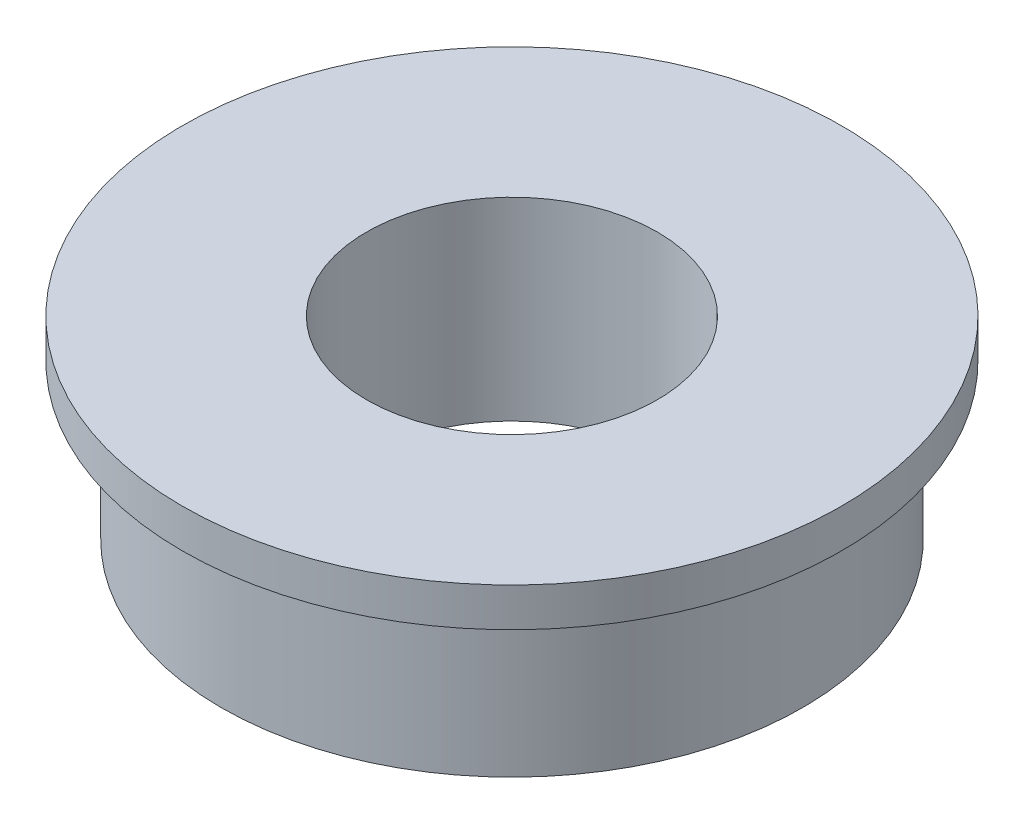
ISO-10303-21;
HEADER;
FILE_DESCRIPTION(('STEP AP214'),'2;1');
FILE_NAME('part.step','',(''),(''),'','','');
FILE_SCHEMA(('AUTOMOTIVE_DESIGN { 1 0 10303 214 1 1 1 1 }'));
ENDSEC;
DATA;
#1=APPLICATION_CONTEXT('core data for automotive mechanical design processes');
#2=APPLICATION_PROTOCOL_DEFINITION('international standard','automotive_design',2000,#1);
#3=PRODUCT_CONTEXT('',#1,'mechanical');
#4=PRODUCT('Part','Part','',(#3));
#5=PRODUCT_RELATED_PRODUCT_CATEGORY('part','',(#4));
#6=PRODUCT_DEFINITION_FORMATION('','',#4);
#7=PRODUCT_DEFINITION_CONTEXT('part definition',#1,'design');
#8=PRODUCT_DEFINITION('design','',#6,#7);
#9=PRODUCT_DEFINITION_SHAPE('','',#8);
#10=(LENGTH_UNIT() NAMED_UNIT(*) SI_UNIT(.MILLI.,.METRE.));
#11=(NAMED_UNIT(*) PLANE_ANGLE_UNIT() SI_UNIT($,.RADIAN.));
#12=(NAMED_UNIT(*) SI_UNIT($,.STERADIAN.) SOLID_ANGLE_UNIT());
#13=UNCERTAINTY_MEASURE_WITH_UNIT(LENGTH_MEASURE(1.E-05),#10,'distance_accuracy_value','');
#14=(GEOMETRIC_REPRESENTATION_CONTEXT(3) GLOBAL_UNCERTAINTY_ASSIGNED_CONTEXT((#13)) GLOBAL_UNIT_ASSIGNED_CONTEXT((#10,
#11,#12)) REPRESENTATION_CONTEXT('',''));
#15=CARTESIAN_POINT('',(0.,0.,0.));
#16=DIRECTION('',(0.,0.,1.));
#17=DIRECTION('',(1.,0.,0.));
#18=AXIS2_PLACEMENT_3D('',#15,#16,#17);
#19=CARTESIAN_POINT('',(0.,0.,0.));
#20=DIRECTION('',(0.,1.,0.));
#21=DIRECTION('',(0.,0.,1.));
#22=AXIS2_PLACEMENT_3D('',#19,#20,#21);
#23=PLANE('',#22);
#24=CARTESIAN_POINT('',(0.,0.,0.));
#25=DIRECTION('',(0.,1.,0.));
#26=DIRECTION('',(0.,0.,1.));
#27=AXIS2_PLACEMENT_3D('',#24,#25,#26);
#28=CIRCLE('',#27,6.);
#29=CARTESIAN_POINT('',(0.,0.,6.));
#30=VERTEX_POINT('',#29);
#31=EDGE_CURVE('E41',#30,#30,#28,.T.);
#32=ORIENTED_EDGE('',*,*,#31,.F.);
#33=EDGE_LOOP('',(#32));
#34=FACE_BOUND('',#33,.T.);
#35=CARTESIAN_POINT('',(0.,0.,0.));
#36=DIRECTION('',(0.,1.,0.));
#37=DIRECTION('',(0.,0.,1.));
#38=AXIS2_PLACEMENT_3D('',#35,#36,#37);
#39=CIRCLE('',#38,3.);
#40=CARTESIAN_POINT('',(0.,0.,3.));
#41=VERTEX_POINT('',#40);
#42=EDGE_CURVE('E50',#41,#41,#39,.T.);
#43=ORIENTED_EDGE('',*,*,#42,.T.);
#44=EDGE_LOOP('',(#43));
#45=FACE_BOUND('',#44,.T.);
#46=ADVANCED_FACE('F37',(#34,#45),#23,.F.);
#47=CARTESIAN_POINT('',(0.,3.2,0.));
#48=DIRECTION('',(0.,-1.,0.));
#49=DIRECTION('',(0.,0.,-1.));
#50=AXIS2_PLACEMENT_3D('',#47,#48,#49);
#51=CYLINDRICAL_SURFACE('',#50,6.);
#52=CARTESIAN_POINT('',(0.,3.2,0.));
#53=DIRECTION('',(0.,1.,0.));
#54=DIRECTION('',(0.,0.,1.));
#55=AXIS2_PLACEMENT_3D('',#52,#53,#54);
#56=CIRCLE('',#55,6.);
#57=CARTESIAN_POINT('',(0.,3.2,6.));
#58=VERTEX_POINT('',#57);
#59=EDGE_CURVE('E10',#58,#58,#56,.T.);
#60=ORIENTED_EDGE('',*,*,#59,.F.);
#61=EDGE_LOOP('',(#60));
#62=FACE_BOUND('',#61,.T.);
#63=ORIENTED_EDGE('',*,*,#31,.T.);
#64=EDGE_LOOP('',(#63));
#65=FACE_BOUND('',#64,.T.);
#66=ADVANCED_FACE('F39',(#62,#65),#51,.T.);
#67=CARTESIAN_POINT('',(0.,3.2,0.));
#68=DIRECTION('',(0.,-1.,0.));
#69=DIRECTION('',(0.,0.,-1.));
#70=AXIS2_PLACEMENT_3D('',#67,#68,#69);
#71=CYLINDRICAL_SURFACE('',#70,3.);
#72=ORIENTED_EDGE('',*,*,#42,.F.);
#73=EDGE_LOOP('',(#72));
#74=FACE_BOUND('',#73,.T.);
#75=CARTESIAN_POINT('',(0.,4.,0.));
#76=DIRECTION('',(0.,1.,0.));
#77=DIRECTION('',(0.,0.,1.));
#78=AXIS2_PLACEMENT_3D('',#75,#76,#77);
#79=CIRCLE('',#78,3.);
#80=CARTESIAN_POINT('',(0.,4.,3.));
#81=VERTEX_POINT('',#80);
#82=EDGE_CURVE('E60',#81,#81,#79,.T.);
#83=ORIENTED_EDGE('',*,*,#82,.T.);
#84=EDGE_LOOP('',(#83));
#85=FACE_BOUND('',#84,.T.);
#86=ADVANCED_FACE('F68',(#74,#85),#71,.F.);
#87=CARTESIAN_POINT('',(0.,4.,0.));
#88=DIRECTION('',(0.,1.,0.));
#89=DIRECTION('',(0.,0.,1.));
#90=AXIS2_PLACEMENT_3D('',#87,#88,#89);
#91=PLANE('',#90);
#92=CARTESIAN_POINT('',(0.,4.,0.));
#93=DIRECTION('',(0.,1.,0.));
#94=DIRECTION('',(0.,0.,1.));
#95=AXIS2_PLACEMENT_3D('',#92,#93,#94);
#96=CIRCLE('',#95,6.8);
#97=CARTESIAN_POINT('',(0.,4.,6.8));
#98=VERTEX_POINT('',#97);
#99=EDGE_CURVE('E55',#98,#98,#96,.T.);
#100=ORIENTED_EDGE('',*,*,#99,.T.);
#101=EDGE_LOOP('',(#100));
#102=FACE_BOUND('',#101,.T.);
#103=ORIENTED_EDGE('',*,*,#82,.F.);
#104=EDGE_LOOP('',(#103));
#105=FACE_BOUND('',#104,.T.);
#106=ADVANCED_FACE('F70',(#102,#105),#91,.T.);
#107=CARTESIAN_POINT('',(0.,3.2,0.));
#108=DIRECTION('',(0.,1.,0.));
#109=DIRECTION('',(0.,0.,1.));
#110=AXIS2_PLACEMENT_3D('',#107,#108,#109);
#111=PLANE('',#110);
#112=ORIENTED_EDGE('',*,*,#59,.T.);
#113=EDGE_LOOP('',(#112));
#114=FACE_BOUND('',#113,.T.);
#115=CARTESIAN_POINT('',(0.,3.2,0.));
#116=DIRECTION('',(0.,1.,0.));
#117=DIRECTION('',(0.,0.,1.));
#118=AXIS2_PLACEMENT_3D('',#115,#116,#117);
#119=CIRCLE('',#118,6.8);
#120=CARTESIAN_POINT('',(0.,3.2,6.8));
#121=VERTEX_POINT('',#120);
#122=EDGE_CURVE('E56',#121,#121,#119,.T.);
#123=ORIENTED_EDGE('',*,*,#122,.F.);
#124=EDGE_LOOP('',(#123));
#125=FACE_BOUND('',#124,.T.);
#126=ADVANCED_FACE('F72',(#114,#125),#111,.F.);
#127=CARTESIAN_POINT('',(0.,4.,0.));
#128=DIRECTION('',(0.,-1.,0.));
#129=DIRECTION('',(0.,0.,-1.));
#130=AXIS2_PLACEMENT_3D('',#127,#128,#129);
#131=CYLINDRICAL_SURFACE('',#130,6.8);
#132=ORIENTED_EDGE('',*,*,#99,.F.);
#133=EDGE_LOOP('',(#132));
#134=FACE_BOUND('',#133,.T.);
#135=ORIENTED_EDGE('',*,*,#122,.T.);
#136=EDGE_LOOP('',(#135));
#137=FACE_BOUND('',#136,.T.);
#138=ADVANCED_FACE('F79',(#134,#137),#131,.T.);
#139=CLOSED_SHELL('',(#46,#66,#86,#106,#126,#138));
#140=MANIFOLD_SOLID_BREP('B2',#139);
#141=ADVANCED_BREP_SHAPE_REPRESENTATION('',(#18,#140),#14);
#142=SHAPE_DEFINITION_REPRESENTATION(#9,#141);
ENDSEC;
END-ISO-10303-21;
